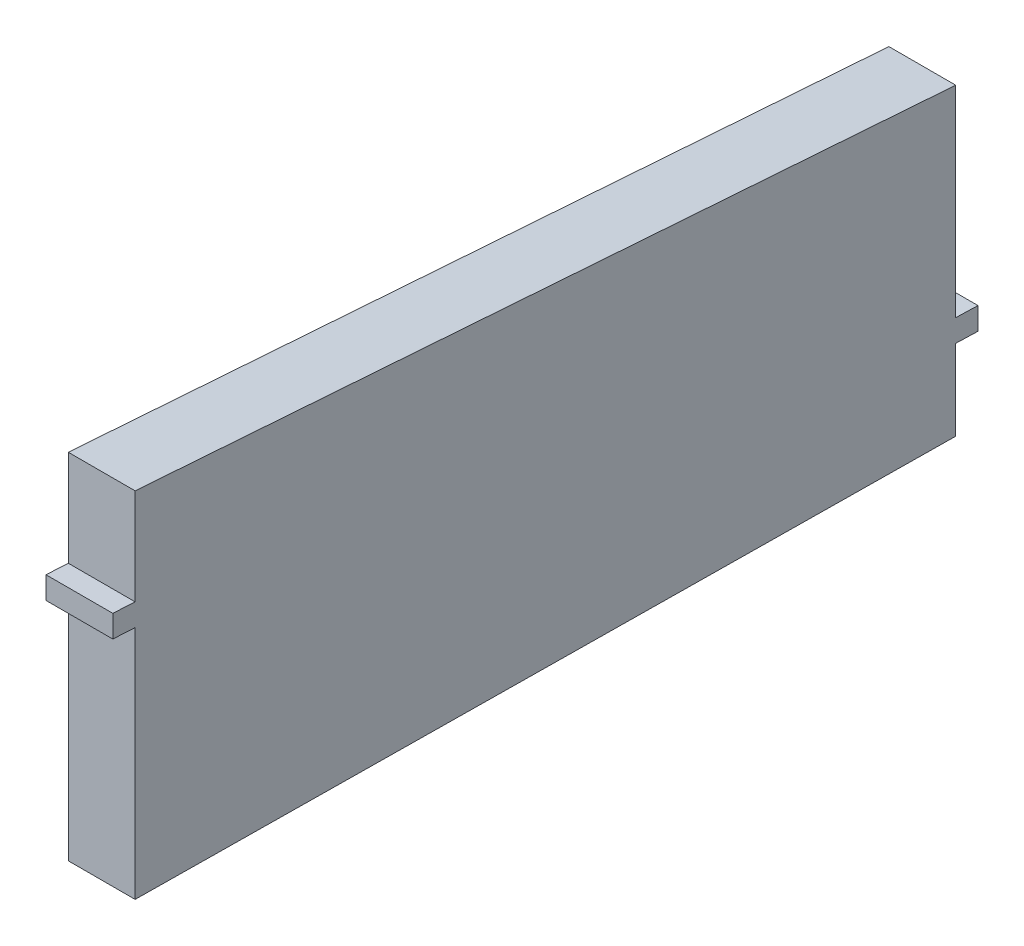
ISO-10303-21;
HEADER;
FILE_DESCRIPTION(('STEP AP214'),'2;1');
FILE_NAME('part.step','',(''),(''),'','','');
FILE_SCHEMA(('AUTOMOTIVE_DESIGN { 1 0 10303 214 1 1 1 1 }'));
ENDSEC;
DATA;
#1=APPLICATION_CONTEXT('core data for automotive mechanical design processes');
#2=APPLICATION_PROTOCOL_DEFINITION('international standard','automotive_design',2000,#1);
#3=PRODUCT_CONTEXT('',#1,'mechanical');
#4=PRODUCT('Part','Part','',(#3));
#5=PRODUCT_RELATED_PRODUCT_CATEGORY('part','',(#4));
#6=PRODUCT_DEFINITION_FORMATION('','',#4);
#7=PRODUCT_DEFINITION_CONTEXT('part definition',#1,'design');
#8=PRODUCT_DEFINITION('design','',#6,#7);
#9=PRODUCT_DEFINITION_SHAPE('','',#8);
#10=(LENGTH_UNIT() NAMED_UNIT(*) SI_UNIT(.MILLI.,.METRE.));
#11=(NAMED_UNIT(*) PLANE_ANGLE_UNIT() SI_UNIT($,.RADIAN.));
#12=(NAMED_UNIT(*) SI_UNIT($,.STERADIAN.) SOLID_ANGLE_UNIT());
#13=UNCERTAINTY_MEASURE_WITH_UNIT(LENGTH_MEASURE(1.E-05),#10,'distance_accuracy_value','');
#14=(GEOMETRIC_REPRESENTATION_CONTEXT(3) GLOBAL_UNCERTAINTY_ASSIGNED_CONTEXT((#13)) GLOBAL_UNIT_ASSIGNED_CONTEXT((#10,
#11,#12)) REPRESENTATION_CONTEXT('',''));
#15=CARTESIAN_POINT('',(0.,0.,0.));
#16=DIRECTION('',(0.,0.,1.));
#17=DIRECTION('',(1.,0.,0.));
#18=AXIS2_PLACEMENT_3D('',#15,#16,#17);
#19=CARTESIAN_POINT('',(243.017706630704,0.,0.));
#20=DIRECTION('',(1.,0.,0.));
#21=DIRECTION('',(0.,0.,1.));
#22=AXIS2_PLACEMENT_3D('',#19,#20,#21);
#23=PLANE('',#22);
#24=DIRECTION('',(0.,-0.0302886855912018,-0.999541192510422));
#25=VECTOR('',#24,1.);
#26=CARTESIAN_POINT('',(243.017706630704,373.849776180412,-1017.12286065991));
#27=LINE('',#26,#25);
#28=CARTESIAN_POINT('',(243.017706630704,373.849776180412,-1017.12286065991));
#29=VERTEX_POINT('',#28);
#30=CARTESIAN_POINT('',(243.017706630704,373.753565461461,-1020.29786065991));
#31=VERTEX_POINT('',#30);
#32=EDGE_CURVE('E128',#29,#31,#27,.T.);
#33=ORIENTED_EDGE('',*,*,#32,.T.);
#34=DIRECTION('',(0.,-1.,0.));
#35=VECTOR('',#34,1.);
#36=CARTESIAN_POINT('',(243.017706630704,373.753565461461,-1020.29786065991));
#37=LINE('',#36,#35);
#38=CARTESIAN_POINT('',(243.017706630704,370.578565461461,-1020.29786065991));
#39=VERTEX_POINT('',#38);
#40=EDGE_CURVE('E131',#31,#39,#37,.T.);
#41=ORIENTED_EDGE('',*,*,#40,.T.);
#42=DIRECTION('',(0.,0.0302886855911669,0.999541192510424));
#43=VECTOR('',#42,1.);
#44=CARTESIAN_POINT('',(243.017706630704,370.578565461461,-1020.29786065991));
#45=LINE('',#44,#43);
#46=CARTESIAN_POINT('',(243.017706630704,370.674776180412,-1017.12286065991));
#47=VERTEX_POINT('',#46);
#48=EDGE_CURVE('E136',#39,#47,#45,.T.);
#49=ORIENTED_EDGE('',*,*,#48,.T.);
#50=DIRECTION('',(0.,-1.,0.));
#51=VECTOR('',#50,1.);
#52=CARTESIAN_POINT('',(243.017706630704,370.674776180412,-1017.12286065991));
#53=LINE('',#52,#51);
#54=CARTESIAN_POINT('',(243.017706630704,359.209569564876,-1017.12286065991));
#55=VERTEX_POINT('',#54);
#56=EDGE_CURVE('E146',#47,#55,#53,.T.);
#57=ORIENTED_EDGE('',*,*,#56,.T.);
#58=DIRECTION('',(0.,0.0111918962029081,0.999937368768356));
#59=VECTOR('',#58,1.);
#60=CARTESIAN_POINT('',(243.017706630704,359.209569564876,-1017.12286065991));
#61=LINE('',#60,#59);
#62=CARTESIAN_POINT('',(243.017706630704,360.518497170758,-900.177027495908));
#63=VERTEX_POINT('',#62);
#64=EDGE_CURVE('E149',#55,#63,#61,.T.);
#65=ORIENTED_EDGE('',*,*,#64,.T.);
#66=DIRECTION('',(0.,1.,0.));
#67=VECTOR('',#66,1.);
#68=CARTESIAN_POINT('',(243.017706630704,360.518497170758,-900.177027495908));
#69=LINE('',#68,#67);
#70=CARTESIAN_POINT('',(243.017706630704,394.071183287948,-900.177027495908));
#71=VERTEX_POINT('',#70);
#72=EDGE_CURVE('E152',#63,#71,#69,.T.);
#73=ORIENTED_EDGE('',*,*,#72,.T.);
#74=DIRECTION('',(0.,0.0527109798388319,0.99860980998808));
#75=VECTOR('',#74,1.);
#76=CARTESIAN_POINT('',(243.017706630704,394.071183287948,-900.177027495908));
#77=LINE('',#76,#75);
#78=CARTESIAN_POINT('',(243.017706630704,394.238773631358,-897.002027495908));
#79=VERTEX_POINT('',#78);
#80=EDGE_CURVE('E155',#71,#79,#77,.T.);
#81=ORIENTED_EDGE('',*,*,#80,.T.);
#82=DIRECTION('',(0.,1.,0.));
#83=VECTOR('',#82,1.);
#84=CARTESIAN_POINT('',(243.017706630704,394.238773631358,-897.002027495908));
#85=LINE('',#84,#83);
#86=CARTESIAN_POINT('',(243.017706630704,397.413773631358,-897.002027495908));
#87=VERTEX_POINT('',#86);
#88=EDGE_CURVE('E158',#79,#87,#85,.T.);
#89=ORIENTED_EDGE('',*,*,#88,.T.);
#90=DIRECTION('',(0.,-0.0527109798388493,-0.99860980998808));
#91=VECTOR('',#90,1.);
#92=CARTESIAN_POINT('',(243.017706630704,397.413773631358,-897.002027495908));
#93=LINE('',#92,#91);
#94=CARTESIAN_POINT('',(243.017706630704,397.246183287948,-900.177027495908));
#95=VERTEX_POINT('',#94);
#96=EDGE_CURVE('E161',#87,#95,#93,.T.);
#97=ORIENTED_EDGE('',*,*,#96,.T.);
#98=DIRECTION('',(0.,1.,0.));
#99=VECTOR('',#98,1.);
#100=CARTESIAN_POINT('',(243.017706630704,397.246183287948,-900.177027495908));
#101=LINE('',#100,#99);
#102=CARTESIAN_POINT('',(243.017706630704,410.946223778431,-900.177027495908));
#103=VERTEX_POINT('',#102);
#104=EDGE_CURVE('E164',#95,#103,#101,.T.);
#105=ORIENTED_EDGE('',*,*,#104,.T.);
#106=DIRECTION('',(0.,-0.0717092651883563,-0.997425576815707));
#107=VECTOR('',#106,1.);
#108=CARTESIAN_POINT('',(243.017706630704,410.946223778431,-900.177027495908));
#109=LINE('',#108,#107);
#110=CARTESIAN_POINT('',(243.017706630704,402.538478922115,-1017.12286065991));
#111=VERTEX_POINT('',#110);
#112=EDGE_CURVE('E167',#103,#111,#109,.T.);
#113=ORIENTED_EDGE('',*,*,#112,.T.);
#114=DIRECTION('',(0.,-1.,0.));
#115=VECTOR('',#114,1.);
#116=CARTESIAN_POINT('',(243.017706630704,402.538478922115,-1017.12286065991));
#117=LINE('',#116,#115);
#118=EDGE_CURVE('E141',#111,#29,#117,.T.);
#119=ORIENTED_EDGE('',*,*,#118,.T.);
#120=EDGE_LOOP('',(#33,#41,#49,#57,#65,#73,#81,#89,#97,#105,#113,#119));
#121=FACE_BOUND('',#120,.T.);
#122=ADVANCED_FACE('F35',(#121),#23,.F.);
#123=CARTESIAN_POINT('',(386.253378848063,402.538478922115,-1017.12286065991));
#124=DIRECTION('',(0.,0.,1.));
#125=DIRECTION('',(-1.,0.,0.));
#126=AXIS2_PLACEMENT_3D('',#123,#124,#125);
#127=PLANE('',#126);
#128=DIRECTION('',(-1.,0.,0.));
#129=VECTOR('',#128,1.);
#130=CARTESIAN_POINT('',(386.253378848063,373.849776180412,-1017.12286065991));
#131=LINE('',#130,#129);
#132=CARTESIAN_POINT('',(252.542706630704,373.849776180412,-1017.12286065991));
#133=VERTEX_POINT('',#132);
#134=EDGE_CURVE('E170',#133,#29,#131,.T.);
#135=ORIENTED_EDGE('',*,*,#134,.T.);
#136=ORIENTED_EDGE('',*,*,#118,.F.);
#137=DIRECTION('',(-1.,0.,0.));
#138=VECTOR('',#137,1.);
#139=CARTESIAN_POINT('',(386.253378848063,402.538478922115,-1017.12286065991));
#140=LINE('',#139,#138);
#141=CARTESIAN_POINT('',(252.542706630704,402.538478922115,-1017.12286065991));
#142=VERTEX_POINT('',#141);
#143=EDGE_CURVE('E172',#142,#111,#140,.T.);
#144=ORIENTED_EDGE('',*,*,#143,.F.);
#145=DIRECTION('',(0.,1.,0.));
#146=VECTOR('',#145,1.);
#147=CARTESIAN_POINT('',(252.542706630704,402.538478922115,-1017.12286065991));
#148=LINE('',#147,#146);
#149=EDGE_CURVE('E39',#133,#142,#148,.T.);
#150=ORIENTED_EDGE('',*,*,#149,.F.);
#151=EDGE_LOOP('',(#135,#136,#144,#150));
#152=FACE_BOUND('',#151,.T.);
#153=ADVANCED_FACE('F239',(#152),#127,.F.);
#154=CARTESIAN_POINT('',(386.253378848063,410.946223778431,-900.177027495908));
#155=DIRECTION('',(0.,-0.997425576815707,0.0717092651883563));
#156=DIRECTION('',(0.,0.0717092651883563,0.997425576815707));
#157=AXIS2_PLACEMENT_3D('',#154,#155,#156);
#158=PLANE('',#157);
#159=ORIENTED_EDGE('',*,*,#143,.T.);
#160=ORIENTED_EDGE('',*,*,#112,.F.);
#161=DIRECTION('',(-1.,0.,0.));
#162=VECTOR('',#161,1.);
#163=CARTESIAN_POINT('',(386.253378848063,410.946223778431,-900.177027495908));
#164=LINE('',#163,#162);
#165=CARTESIAN_POINT('',(252.542706630704,410.946223778431,-900.177027495908));
#166=VERTEX_POINT('',#165);
#167=EDGE_CURVE('E174',#166,#103,#164,.T.);
#168=ORIENTED_EDGE('',*,*,#167,.F.);
#169=DIRECTION('',(0.,0.0717092651883563,0.997425576815707));
#170=VECTOR('',#169,1.);
#171=CARTESIAN_POINT('',(252.542706630704,410.946223778431,-900.177027495908));
#172=LINE('',#171,#170);
#173=EDGE_CURVE('E235',#142,#166,#172,.T.);
#174=ORIENTED_EDGE('',*,*,#173,.F.);
#175=EDGE_LOOP('',(#159,#160,#168,#174));
#176=FACE_BOUND('',#175,.T.);
#177=ADVANCED_FACE('F232',(#176),#158,.F.);
#178=CARTESIAN_POINT('',(386.253378848063,397.246183287948,-900.177027495908));
#179=DIRECTION('',(0.,0.,-1.));
#180=DIRECTION('',(0.,-1.,0.));
#181=AXIS2_PLACEMENT_3D('',#178,#179,#180);
#182=PLANE('',#181);
#183=ORIENTED_EDGE('',*,*,#167,.T.);
#184=ORIENTED_EDGE('',*,*,#104,.F.);
#185=DIRECTION('',(-1.,0.,0.));
#186=VECTOR('',#185,1.);
#187=CARTESIAN_POINT('',(386.253378848063,397.246183287948,-900.177027495908));
#188=LINE('',#187,#186);
#189=CARTESIAN_POINT('',(252.542706630704,397.246183287948,-900.177027495908));
#190=VERTEX_POINT('',#189);
#191=EDGE_CURVE('E176',#190,#95,#188,.T.);
#192=ORIENTED_EDGE('',*,*,#191,.F.);
#193=DIRECTION('',(0.,-1.,0.));
#194=VECTOR('',#193,1.);
#195=CARTESIAN_POINT('',(252.542706630704,397.246183287948,-900.177027495908));
#196=LINE('',#195,#194);
#197=EDGE_CURVE('E241',#166,#190,#196,.T.);
#198=ORIENTED_EDGE('',*,*,#197,.F.);
#199=EDGE_LOOP('',(#183,#184,#192,#198));
#200=FACE_BOUND('',#199,.T.);
#201=ADVANCED_FACE('F228',(#200),#182,.F.);
#202=CARTESIAN_POINT('',(386.253378848063,397.413773631358,-897.002027495908));
#203=DIRECTION('',(0.,-0.99860980998808,0.0527109798388493));
#204=DIRECTION('',(0.,0.0527109798388493,0.99860980998808));
#205=AXIS2_PLACEMENT_3D('',#202,#203,#204);
#206=PLANE('',#205);
#207=ORIENTED_EDGE('',*,*,#191,.T.);
#208=ORIENTED_EDGE('',*,*,#96,.F.);
#209=DIRECTION('',(-1.,0.,0.));
#210=VECTOR('',#209,1.);
#211=CARTESIAN_POINT('',(386.253378848063,397.413773631358,-897.002027495908));
#212=LINE('',#211,#210);
#213=CARTESIAN_POINT('',(252.542706630704,397.413773631358,-897.002027495908));
#214=VERTEX_POINT('',#213);
#215=EDGE_CURVE('E178',#214,#87,#212,.T.);
#216=ORIENTED_EDGE('',*,*,#215,.F.);
#217=DIRECTION('',(0.,0.0527109798388493,0.99860980998808));
#218=VECTOR('',#217,1.);
#219=CARTESIAN_POINT('',(252.542706630704,397.413773631358,-897.002027495908));
#220=LINE('',#219,#218);
#221=EDGE_CURVE('E225',#190,#214,#220,.T.);
#222=ORIENTED_EDGE('',*,*,#221,.F.);
#223=EDGE_LOOP('',(#207,#208,#216,#222));
#224=FACE_BOUND('',#223,.T.);
#225=ADVANCED_FACE('F222',(#224),#206,.F.);
#226=CARTESIAN_POINT('',(386.253378848063,394.238773631358,-897.002027495908));
#227=DIRECTION('',(0.,0.,-1.));
#228=DIRECTION('',(1.,0.,0.));
#229=AXIS2_PLACEMENT_3D('',#226,#227,#228);
#230=PLANE('',#229);
#231=ORIENTED_EDGE('',*,*,#215,.T.);
#232=ORIENTED_EDGE('',*,*,#88,.F.);
#233=DIRECTION('',(-1.,0.,0.));
#234=VECTOR('',#233,1.);
#235=CARTESIAN_POINT('',(386.253378848063,394.238773631358,-897.002027495908));
#236=LINE('',#235,#234);
#237=CARTESIAN_POINT('',(252.542706630704,394.238773631358,-897.002027495908));
#238=VERTEX_POINT('',#237);
#239=EDGE_CURVE('E180',#238,#79,#236,.T.);
#240=ORIENTED_EDGE('',*,*,#239,.F.);
#241=DIRECTION('',(0.,-1.,0.));
#242=VECTOR('',#241,1.);
#243=CARTESIAN_POINT('',(252.542706630704,394.238773631358,-897.002027495908));
#244=LINE('',#243,#242);
#245=EDGE_CURVE('E219',#214,#238,#244,.T.);
#246=ORIENTED_EDGE('',*,*,#245,.F.);
#247=EDGE_LOOP('',(#231,#232,#240,#246));
#248=FACE_BOUND('',#247,.T.);
#249=ADVANCED_FACE('F216',(#248),#230,.F.);
#250=CARTESIAN_POINT('',(386.253378848063,394.071183287948,-900.177027495908));
#251=DIRECTION('',(0.,0.99860980998808,-0.0527109798388319));
#252=DIRECTION('',(0.,-0.0527109798388319,-0.998609809988081));
#253=AXIS2_PLACEMENT_3D('',#250,#251,#252);
#254=PLANE('',#253);
#255=ORIENTED_EDGE('',*,*,#239,.T.);
#256=ORIENTED_EDGE('',*,*,#80,.F.);
#257=DIRECTION('',(-1.,0.,0.));
#258=VECTOR('',#257,1.);
#259=CARTESIAN_POINT('',(386.253378848063,394.071183287948,-900.177027495908));
#260=LINE('',#259,#258);
#261=CARTESIAN_POINT('',(252.542706630704,394.071183287948,-900.177027495908));
#262=VERTEX_POINT('',#261);
#263=EDGE_CURVE('E182',#262,#71,#260,.T.);
#264=ORIENTED_EDGE('',*,*,#263,.F.);
#265=DIRECTION('',(0.,-0.0527109798388319,-0.998609809988081));
#266=VECTOR('',#265,1.);
#267=CARTESIAN_POINT('',(252.542706630704,394.071183287948,-900.177027495908));
#268=LINE('',#267,#266);
#269=EDGE_CURVE('E247',#238,#262,#268,.T.);
#270=ORIENTED_EDGE('',*,*,#269,.F.);
#271=EDGE_LOOP('',(#255,#256,#264,#270));
#272=FACE_BOUND('',#271,.T.);
#273=ADVANCED_FACE('F211',(#272),#254,.F.);
#274=CARTESIAN_POINT('',(386.253378848063,360.518497170758,-900.177027495908));
#275=DIRECTION('',(0.,0.,-1.));
#276=DIRECTION('',(1.,0.,0.));
#277=AXIS2_PLACEMENT_3D('',#274,#275,#276);
#278=PLANE('',#277);
#279=ORIENTED_EDGE('',*,*,#263,.T.);
#280=ORIENTED_EDGE('',*,*,#72,.F.);
#281=DIRECTION('',(-1.,0.,0.));
#282=VECTOR('',#281,1.);
#283=CARTESIAN_POINT('',(386.253378848063,360.518497170758,-900.177027495908));
#284=LINE('',#283,#282);
#285=CARTESIAN_POINT('',(252.542706630704,360.518497170758,-900.177027495908));
#286=VERTEX_POINT('',#285);
#287=EDGE_CURVE('E184',#286,#63,#284,.T.);
#288=ORIENTED_EDGE('',*,*,#287,.F.);
#289=DIRECTION('',(0.,-1.,0.));
#290=VECTOR('',#289,1.);
#291=CARTESIAN_POINT('',(252.542706630704,360.518497170758,-900.177027495908));
#292=LINE('',#291,#290);
#293=EDGE_CURVE('E208',#262,#286,#292,.T.);
#294=ORIENTED_EDGE('',*,*,#293,.F.);
#295=EDGE_LOOP('',(#279,#280,#288,#294));
#296=FACE_BOUND('',#295,.T.);
#297=ADVANCED_FACE('F205',(#296),#278,.F.);
#298=CARTESIAN_POINT('',(386.253378848063,359.209569564876,-1017.12286065991));
#299=DIRECTION('',(0.,0.999937368768356,-0.0111918962029081));
#300=DIRECTION('',(0.,-0.0111918962029081,-0.999937368768356));
#301=AXIS2_PLACEMENT_3D('',#298,#299,#300);
#302=PLANE('',#301);
#303=ORIENTED_EDGE('',*,*,#287,.T.);
#304=ORIENTED_EDGE('',*,*,#64,.F.);
#305=DIRECTION('',(-1.,0.,0.));
#306=VECTOR('',#305,1.);
#307=CARTESIAN_POINT('',(386.253378848063,359.209569564876,-1017.12286065991));
#308=LINE('',#307,#306);
#309=CARTESIAN_POINT('',(252.542706630704,359.209569564876,-1017.12286065991));
#310=VERTEX_POINT('',#309);
#311=EDGE_CURVE('E186',#310,#55,#308,.T.);
#312=ORIENTED_EDGE('',*,*,#311,.F.);
#313=DIRECTION('',(0.,-0.0111918962029081,-0.999937368768356));
#314=VECTOR('',#313,1.);
#315=CARTESIAN_POINT('',(252.542706630704,359.209569564876,-1017.12286065991));
#316=LINE('',#315,#314);
#317=EDGE_CURVE('E202',#286,#310,#316,.T.);
#318=ORIENTED_EDGE('',*,*,#317,.F.);
#319=EDGE_LOOP('',(#303,#304,#312,#318));
#320=FACE_BOUND('',#319,.T.);
#321=ADVANCED_FACE('F199',(#320),#302,.F.);
#322=CARTESIAN_POINT('',(386.253378848063,370.674776180412,-1017.12286065991));
#323=DIRECTION('',(0.,0.,1.));
#324=DIRECTION('',(-1.,0.,0.));
#325=AXIS2_PLACEMENT_3D('',#322,#323,#324);
#326=PLANE('',#325);
#327=ORIENTED_EDGE('',*,*,#311,.T.);
#328=ORIENTED_EDGE('',*,*,#56,.F.);
#329=DIRECTION('',(-1.,0.,0.));
#330=VECTOR('',#329,1.);
#331=CARTESIAN_POINT('',(386.253378848063,370.674776180412,-1017.12286065991));
#332=LINE('',#331,#330);
#333=CARTESIAN_POINT('',(252.542706630704,370.674776180412,-1017.12286065991));
#334=VERTEX_POINT('',#333);
#335=EDGE_CURVE('E188',#334,#47,#332,.T.);
#336=ORIENTED_EDGE('',*,*,#335,.F.);
#337=DIRECTION('',(0.,1.,0.));
#338=VECTOR('',#337,1.);
#339=CARTESIAN_POINT('',(252.542706630704,370.674776180412,-1017.12286065991));
#340=LINE('',#339,#338);
#341=EDGE_CURVE('E251',#310,#334,#340,.T.);
#342=ORIENTED_EDGE('',*,*,#341,.F.);
#343=EDGE_LOOP('',(#327,#328,#336,#342));
#344=FACE_BOUND('',#343,.T.);
#345=ADVANCED_FACE('F194',(#344),#326,.F.);
#346=CARTESIAN_POINT('',(386.253378848063,370.578565461461,-1020.29786065991));
#347=DIRECTION('',(0.,0.999541192510423,-0.0302886855911669));
#348=DIRECTION('',(0.,-0.0302886855911669,-0.999541192510424));
#349=AXIS2_PLACEMENT_3D('',#346,#347,#348);
#350=PLANE('',#349);
#351=ORIENTED_EDGE('',*,*,#335,.T.);
#352=ORIENTED_EDGE('',*,*,#48,.F.);
#353=DIRECTION('',(-1.,0.,0.));
#354=VECTOR('',#353,1.);
#355=CARTESIAN_POINT('',(386.253378848063,370.578565461461,-1020.29786065991));
#356=LINE('',#355,#354);
#357=CARTESIAN_POINT('',(252.542706630704,370.578565461461,-1020.29786065991));
#358=VERTEX_POINT('',#357);
#359=EDGE_CURVE('E129',#358,#39,#356,.T.);
#360=ORIENTED_EDGE('',*,*,#359,.F.);
#361=DIRECTION('',(0.,-0.0302886855911669,-0.999541192510424));
#362=VECTOR('',#361,1.);
#363=CARTESIAN_POINT('',(252.542706630704,370.578565461461,-1020.29786065991));
#364=LINE('',#363,#362);
#365=EDGE_CURVE('E58',#334,#358,#364,.T.);
#366=ORIENTED_EDGE('',*,*,#365,.F.);
#367=EDGE_LOOP('',(#351,#352,#360,#366));
#368=FACE_BOUND('',#367,.T.);
#369=ADVANCED_FACE('F192',(#368),#350,.F.);
#370=CARTESIAN_POINT('',(386.253378848063,373.753565461461,-1020.29786065991));
#371=DIRECTION('',(0.,0.,1.));
#372=DIRECTION('',(-1.,0.,0.));
#373=AXIS2_PLACEMENT_3D('',#370,#371,#372);
#374=PLANE('',#373);
#375=ORIENTED_EDGE('',*,*,#359,.T.);
#376=ORIENTED_EDGE('',*,*,#40,.F.);
#377=DIRECTION('',(-1.,0.,0.));
#378=VECTOR('',#377,1.);
#379=CARTESIAN_POINT('',(386.253378848063,373.753565461461,-1020.29786065991));
#380=LINE('',#379,#378);
#381=CARTESIAN_POINT('',(252.542706630704,373.753565461461,-1020.29786065991));
#382=VERTEX_POINT('',#381);
#383=EDGE_CURVE('E124',#382,#31,#380,.T.);
#384=ORIENTED_EDGE('',*,*,#383,.F.);
#385=DIRECTION('',(0.,1.,0.));
#386=VECTOR('',#385,1.);
#387=CARTESIAN_POINT('',(252.542706630704,373.753565461461,-1020.29786065991));
#388=LINE('',#387,#386);
#389=EDGE_CURVE('E44',#358,#382,#388,.T.);
#390=ORIENTED_EDGE('',*,*,#389,.F.);
#391=EDGE_LOOP('',(#375,#376,#384,#390));
#392=FACE_BOUND('',#391,.T.);
#393=ADVANCED_FACE('F132',(#392),#374,.F.);
#394=CARTESIAN_POINT('',(386.253378848063,373.849776180412,-1017.12286065991));
#395=DIRECTION('',(0.,-0.999541192510422,0.0302886855912018));
#396=DIRECTION('',(0.,0.0302886855912018,0.999541192510422));
#397=AXIS2_PLACEMENT_3D('',#394,#395,#396);
#398=PLANE('',#397);
#399=ORIENTED_EDGE('',*,*,#383,.T.);
#400=ORIENTED_EDGE('',*,*,#32,.F.);
#401=ORIENTED_EDGE('',*,*,#134,.F.);
#402=DIRECTION('',(0.,0.0302886855912018,0.999541192510423));
#403=VECTOR('',#402,1.);
#404=CARTESIAN_POINT('',(252.542706630704,373.849776180412,-1017.12286065991));
#405=LINE('',#404,#403);
#406=EDGE_CURVE('E11',#382,#133,#405,.T.);
#407=ORIENTED_EDGE('',*,*,#406,.F.);
#408=EDGE_LOOP('',(#399,#400,#401,#407));
#409=FACE_BOUND('',#408,.T.);
#410=ADVANCED_FACE('F37',(#409),#398,.F.);
#411=CARTESIAN_POINT('',(252.542706630704,344.83433889611,-776.881194154094));
#412=DIRECTION('',(-1.,0.,0.));
#413=DIRECTION('',(0.,0.,-1.));
#414=AXIS2_PLACEMENT_3D('',#411,#412,#413);
#415=PLANE('',#414);
#416=ORIENTED_EDGE('',*,*,#389,.T.);
#417=ORIENTED_EDGE('',*,*,#406,.T.);
#418=ORIENTED_EDGE('',*,*,#149,.T.);
#419=ORIENTED_EDGE('',*,*,#173,.T.);
#420=ORIENTED_EDGE('',*,*,#197,.T.);
#421=ORIENTED_EDGE('',*,*,#221,.T.);
#422=ORIENTED_EDGE('',*,*,#245,.T.);
#423=ORIENTED_EDGE('',*,*,#269,.T.);
#424=ORIENTED_EDGE('',*,*,#293,.T.);
#425=ORIENTED_EDGE('',*,*,#317,.T.);
#426=ORIENTED_EDGE('',*,*,#341,.T.);
#427=ORIENTED_EDGE('',*,*,#365,.T.);
#428=EDGE_LOOP('',(#416,#417,#418,#419,#420,#421,#422,#423,#424,#425,#426,#427));
#429=FACE_BOUND('',#428,.T.);
#430=ADVANCED_FACE('F253',(#429),#415,.F.);
#431=CLOSED_SHELL('',(#122,#153,#177,#201,#225,#249,#273,#297,#321,#345,#369,#393,#410,#430));
#432=MANIFOLD_SOLID_BREP('B2',#431);
#433=ADVANCED_BREP_SHAPE_REPRESENTATION('',(#18,#432),#14);
#434=SHAPE_DEFINITION_REPRESENTATION(#9,#433);
ENDSEC;
END-ISO-10303-21;
